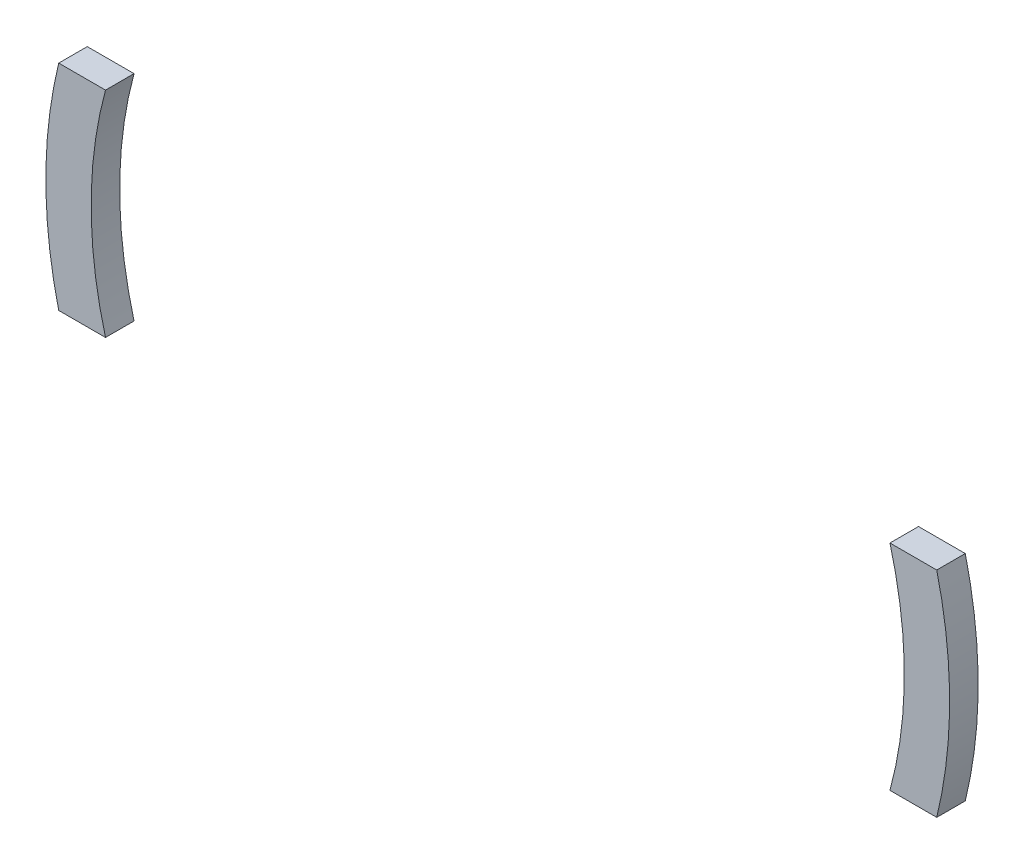
ISO-10303-21;
HEADER;
FILE_DESCRIPTION(('STEP AP214'),'2;1');
FILE_NAME('part.step','',(''),(''),'','','');
FILE_SCHEMA(('AUTOMOTIVE_DESIGN { 1 0 10303 214 1 1 1 1 }'));
ENDSEC;
DATA;
#1=APPLICATION_CONTEXT('core data for automotive mechanical design processes');
#2=APPLICATION_PROTOCOL_DEFINITION('international standard','automotive_design',2000,#1);
#3=PRODUCT_CONTEXT('',#1,'mechanical');
#4=PRODUCT('Part','Part','',(#3));
#5=PRODUCT_RELATED_PRODUCT_CATEGORY('part','',(#4));
#6=PRODUCT_DEFINITION_FORMATION('','',#4);
#7=PRODUCT_DEFINITION_CONTEXT('part definition',#1,'design');
#8=PRODUCT_DEFINITION('design','',#6,#7);
#9=PRODUCT_DEFINITION_SHAPE('','',#8);
#10=(LENGTH_UNIT() NAMED_UNIT(*) SI_UNIT(.MILLI.,.METRE.));
#11=(NAMED_UNIT(*) PLANE_ANGLE_UNIT() SI_UNIT($,.RADIAN.));
#12=(NAMED_UNIT(*) SI_UNIT($,.STERADIAN.) SOLID_ANGLE_UNIT());
#13=UNCERTAINTY_MEASURE_WITH_UNIT(LENGTH_MEASURE(1.E-05),#10,'distance_accuracy_value','');
#14=(GEOMETRIC_REPRESENTATION_CONTEXT(3) GLOBAL_UNCERTAINTY_ASSIGNED_CONTEXT((#13)) GLOBAL_UNIT_ASSIGNED_CONTEXT((#10,
#11,#12)) REPRESENTATION_CONTEXT('',''));
#15=CARTESIAN_POINT('',(0.,0.,0.));
#16=DIRECTION('',(0.,0.,1.));
#17=DIRECTION('',(1.,0.,0.));
#18=AXIS2_PLACEMENT_3D('',#15,#16,#17);
#19=CARTESIAN_POINT('',(0.,0.,2.54));
#20=DIRECTION('',(0.,0.,-1.));
#21=DIRECTION('',(-1.,0.,0.));
#22=AXIS2_PLACEMENT_3D('',#19,#20,#21);
#23=CYLINDRICAL_SURFACE('',#22,36.19);
#24=CARTESIAN_POINT('',(0.,0.,0.));
#25=DIRECTION('',(0.,0.,-1.));
#26=DIRECTION('',(1.,0.,0.));
#27=AXIS2_PLACEMENT_3D('',#24,#25,#26);
#28=CIRCLE('',#27,36.19);
#29=CARTESIAN_POINT('',(34.9112707270073,9.53515999999999,0.));
#30=VERTEX_POINT('',#29);
#31=CARTESIAN_POINT('',(34.9112707270073,-9.53515999999999,0.));
#32=VERTEX_POINT('',#31);
#33=EDGE_CURVE('E110',#30,#32,#28,.T.);
#34=ORIENTED_EDGE('',*,*,#33,.T.);
#35=DIRECTION('',(0.,0.,-1.));
#36=VECTOR('',#35,1.);
#37=CARTESIAN_POINT('',(34.9112707270073,-9.53515999999999,2.54));
#38=LINE('',#37,#36);
#39=CARTESIAN_POINT('',(34.9112707270073,-9.53515999999999,2.54));
#40=VERTEX_POINT('',#39);
#41=EDGE_CURVE('E12',#40,#32,#38,.T.);
#42=ORIENTED_EDGE('',*,*,#41,.F.);
#43=CARTESIAN_POINT('',(0.,0.,2.54));
#44=DIRECTION('',(0.,0.,-1.));
#45=DIRECTION('',(1.,0.,0.));
#46=AXIS2_PLACEMENT_3D('',#43,#44,#45);
#47=CIRCLE('',#46,36.19);
#48=CARTESIAN_POINT('',(34.9112707270073,9.53515999999999,2.54));
#49=VERTEX_POINT('',#48);
#50=EDGE_CURVE('E98',#49,#40,#47,.T.);
#51=ORIENTED_EDGE('',*,*,#50,.F.);
#52=DIRECTION('',(0.,0.,-1.));
#53=VECTOR('',#52,1.);
#54=CARTESIAN_POINT('',(34.9112707270073,9.53515999999999,2.54));
#55=LINE('',#54,#53);
#56=EDGE_CURVE('E106',#49,#30,#55,.T.);
#57=ORIENTED_EDGE('',*,*,#56,.T.);
#58=EDGE_LOOP('',(#34,#42,#51,#57));
#59=FACE_BOUND('',#58,.T.);
#60=ADVANCED_FACE('F47',(#59),#23,.F.);
#61=CARTESIAN_POINT('',(34.9112707270073,-9.53515999999999,2.54));
#62=DIRECTION('',(0.,1.,0.));
#63=DIRECTION('',(-1.,0.,0.));
#64=AXIS2_PLACEMENT_3D('',#61,#62,#63);
#65=PLANE('',#64);
#66=DIRECTION('',(1.,0.,0.));
#67=VECTOR('',#66,1.);
#68=CARTESIAN_POINT('',(34.9112707270073,-9.53515999999999,0.));
#69=LINE('',#68,#67);
#70=CARTESIAN_POINT('',(39.0757008737451,-9.53515999999999,0.));
#71=VERTEX_POINT('',#70);
#72=EDGE_CURVE('E102',#32,#71,#69,.T.);
#73=ORIENTED_EDGE('',*,*,#72,.T.);
#74=DIRECTION('',(0.,0.,-1.));
#75=VECTOR('',#74,1.);
#76=CARTESIAN_POINT('',(39.0757008737451,-9.53515999999999,2.54));
#77=LINE('',#76,#75);
#78=CARTESIAN_POINT('',(39.0757008737451,-9.53515999999999,2.54));
#79=VERTEX_POINT('',#78);
#80=EDGE_CURVE('E55',#79,#71,#77,.T.);
#81=ORIENTED_EDGE('',*,*,#80,.F.);
#82=DIRECTION('',(1.,0.,0.));
#83=VECTOR('',#82,1.);
#84=CARTESIAN_POINT('',(34.9112707270073,-9.53515999999999,2.54));
#85=LINE('',#84,#83);
#86=EDGE_CURVE('E93',#40,#79,#85,.T.);
#87=ORIENTED_EDGE('',*,*,#86,.F.);
#88=ORIENTED_EDGE('',*,*,#41,.T.);
#89=EDGE_LOOP('',(#73,#81,#87,#88));
#90=FACE_BOUND('',#89,.T.);
#91=ADVANCED_FACE('F101',(#90),#65,.F.);
#92=CARTESIAN_POINT('',(0.,0.,2.54));
#93=DIRECTION('',(0.,0.,-1.));
#94=DIRECTION('',(-1.,0.,0.));
#95=AXIS2_PLACEMENT_3D('',#92,#93,#94);
#96=CYLINDRICAL_SURFACE('',#95,40.2222534798835);
#97=CARTESIAN_POINT('',(0.,0.,0.));
#98=DIRECTION('',(0.,0.,1.));
#99=DIRECTION('',(1.,0.,0.));
#100=AXIS2_PLACEMENT_3D('',#97,#98,#99);
#101=CIRCLE('',#100,40.2222534798835);
#102=CARTESIAN_POINT('',(39.0757008737451,9.53516,0.));
#103=VERTEX_POINT('',#102);
#104=EDGE_CURVE('E80',#71,#103,#101,.T.);
#105=ORIENTED_EDGE('',*,*,#104,.T.);
#106=DIRECTION('',(0.,0.,-1.));
#107=VECTOR('',#106,1.);
#108=CARTESIAN_POINT('',(39.0757008737451,9.53516,2.54));
#109=LINE('',#108,#107);
#110=CARTESIAN_POINT('',(39.0757008737451,9.53516,2.54));
#111=VERTEX_POINT('',#110);
#112=EDGE_CURVE('E103',#111,#103,#109,.T.);
#113=ORIENTED_EDGE('',*,*,#112,.F.);
#114=CARTESIAN_POINT('',(0.,0.,2.54));
#115=DIRECTION('',(0.,0.,1.));
#116=DIRECTION('',(1.,0.,0.));
#117=AXIS2_PLACEMENT_3D('',#114,#115,#116);
#118=CIRCLE('',#117,40.2222534798835);
#119=EDGE_CURVE('E96',#79,#111,#118,.T.);
#120=ORIENTED_EDGE('',*,*,#119,.F.);
#121=ORIENTED_EDGE('',*,*,#80,.T.);
#122=EDGE_LOOP('',(#105,#113,#120,#121));
#123=FACE_BOUND('',#122,.T.);
#124=ADVANCED_FACE('F104',(#123),#96,.T.);
#125=CARTESIAN_POINT('',(34.9112707270073,9.53515999999999,2.54));
#126=DIRECTION('',(0.,-1.,0.));
#127=DIRECTION('',(0.,0.,-1.));
#128=AXIS2_PLACEMENT_3D('',#125,#126,#127);
#129=PLANE('',#128);
#130=DIRECTION('',(-1.,0.,0.));
#131=VECTOR('',#130,1.);
#132=CARTESIAN_POINT('',(34.9112707270073,9.53515999999999,0.));
#133=LINE('',#132,#131);
#134=EDGE_CURVE('E86',#103,#30,#133,.T.);
#135=ORIENTED_EDGE('',*,*,#134,.T.);
#136=ORIENTED_EDGE('',*,*,#56,.F.);
#137=DIRECTION('',(-1.,0.,0.));
#138=VECTOR('',#137,1.);
#139=CARTESIAN_POINT('',(34.9112707270073,9.53515999999999,2.54));
#140=LINE('',#139,#138);
#141=EDGE_CURVE('E63',#111,#49,#140,.T.);
#142=ORIENTED_EDGE('',*,*,#141,.F.);
#143=ORIENTED_EDGE('',*,*,#112,.T.);
#144=EDGE_LOOP('',(#135,#136,#142,#143));
#145=FACE_BOUND('',#144,.T.);
#146=ADVANCED_FACE('F117',(#145),#129,.F.);
#147=CARTESIAN_POINT('',(0.,0.,2.54));
#148=DIRECTION('',(0.,0.,1.));
#149=DIRECTION('',(1.,0.,0.));
#150=AXIS2_PLACEMENT_3D('',#147,#148,#149);
#151=PLANE('',#150);
#152=ORIENTED_EDGE('',*,*,#50,.T.);
#153=ORIENTED_EDGE('',*,*,#86,.T.);
#154=ORIENTED_EDGE('',*,*,#119,.T.);
#155=ORIENTED_EDGE('',*,*,#141,.T.);
#156=EDGE_LOOP('',(#152,#153,#154,#155));
#157=FACE_BOUND('',#156,.T.);
#158=ADVANCED_FACE('F94',(#157),#151,.T.);
#159=CARTESIAN_POINT('',(0.,0.,0.));
#160=DIRECTION('',(0.,0.,1.));
#161=DIRECTION('',(1.,0.,0.));
#162=AXIS2_PLACEMENT_3D('',#159,#160,#161);
#163=PLANE('',#162);
#164=ORIENTED_EDGE('',*,*,#33,.F.);
#165=ORIENTED_EDGE('',*,*,#134,.F.);
#166=ORIENTED_EDGE('',*,*,#104,.F.);
#167=ORIENTED_EDGE('',*,*,#72,.F.);
#168=EDGE_LOOP('',(#164,#165,#166,#167));
#169=FACE_BOUND('',#168,.T.);
#170=ADVANCED_FACE('F120',(#169),#163,.F.);
#171=CLOSED_SHELL('',(#60,#91,#124,#146,#158,#170));
#172=MANIFOLD_SOLID_BREP('B2',#171);
#173=CARTESIAN_POINT('',(0.,0.,2.54));
#174=DIRECTION('',(0.,0.,-1.));
#175=DIRECTION('',(-1.,0.,0.));
#176=AXIS2_PLACEMENT_3D('',#173,#174,#175);
#177=CYLINDRICAL_SURFACE('',#176,36.19);
#178=CARTESIAN_POINT('',(0.,0.,0.));
#179=DIRECTION('',(0.,0.,-1.));
#180=DIRECTION('',(1.,0.,0.));
#181=AXIS2_PLACEMENT_3D('',#178,#179,#180);
#182=CIRCLE('',#181,36.19);
#183=CARTESIAN_POINT('',(-34.9112707270073,-9.53516000000002,0.));
#184=VERTEX_POINT('',#183);
#185=CARTESIAN_POINT('',(-34.9112707270073,9.53516,0.));
#186=VERTEX_POINT('',#185);
#187=EDGE_CURVE('E234',#184,#186,#182,.T.);
#188=ORIENTED_EDGE('',*,*,#187,.T.);
#189=DIRECTION('',(0.,0.,-1.));
#190=VECTOR('',#189,1.);
#191=CARTESIAN_POINT('',(-34.9112707270073,9.53516,2.54));
#192=LINE('',#191,#190);
#193=CARTESIAN_POINT('',(-34.9112707270073,9.53516,2.54));
#194=VERTEX_POINT('',#193);
#195=EDGE_CURVE('E45',#194,#186,#192,.T.);
#196=ORIENTED_EDGE('',*,*,#195,.F.);
#197=CARTESIAN_POINT('',(0.,0.,2.54));
#198=DIRECTION('',(0.,0.,-1.));
#199=DIRECTION('',(1.,0.,0.));
#200=AXIS2_PLACEMENT_3D('',#197,#198,#199);
#201=CIRCLE('',#200,36.19);
#202=CARTESIAN_POINT('',(-34.9112707270073,-9.53516000000002,2.54));
#203=VERTEX_POINT('',#202);
#204=EDGE_CURVE('E222',#203,#194,#201,.T.);
#205=ORIENTED_EDGE('',*,*,#204,.F.);
#206=DIRECTION('',(0.,0.,-1.));
#207=VECTOR('',#206,1.);
#208=CARTESIAN_POINT('',(-34.9112707270073,-9.53516000000002,2.54));
#209=LINE('',#208,#207);
#210=EDGE_CURVE('E230',#203,#184,#209,.T.);
#211=ORIENTED_EDGE('',*,*,#210,.T.);
#212=EDGE_LOOP('',(#188,#196,#205,#211));
#213=FACE_BOUND('',#212,.T.);
#214=ADVANCED_FACE('F171',(#213),#177,.F.);
#215=CARTESIAN_POINT('',(-39.0757008737451,9.53516,2.54));
#216=DIRECTION('',(0.,-1.,0.));
#217=DIRECTION('',(0.,0.,-1.));
#218=AXIS2_PLACEMENT_3D('',#215,#216,#217);
#219=PLANE('',#218);
#220=DIRECTION('',(-1.,0.,0.));
#221=VECTOR('',#220,1.);
#222=CARTESIAN_POINT('',(-39.0757008737451,9.53516,0.));
#223=LINE('',#222,#221);
#224=CARTESIAN_POINT('',(-39.0757008737451,9.53516000000001,0.));
#225=VERTEX_POINT('',#224);
#226=EDGE_CURVE('E226',#186,#225,#223,.T.);
#227=ORIENTED_EDGE('',*,*,#226,.T.);
#228=DIRECTION('',(0.,0.,-1.));
#229=VECTOR('',#228,1.);
#230=CARTESIAN_POINT('',(-39.0757008737451,9.53516000000001,2.54));
#231=LINE('',#230,#229);
#232=CARTESIAN_POINT('',(-39.0757008737451,9.53516000000001,2.54));
#233=VERTEX_POINT('',#232);
#234=EDGE_CURVE('E179',#233,#225,#231,.T.);
#235=ORIENTED_EDGE('',*,*,#234,.F.);
#236=DIRECTION('',(-1.,0.,0.));
#237=VECTOR('',#236,1.);
#238=CARTESIAN_POINT('',(-39.0757008737451,9.53516,2.54));
#239=LINE('',#238,#237);
#240=EDGE_CURVE('E217',#194,#233,#239,.T.);
#241=ORIENTED_EDGE('',*,*,#240,.F.);
#242=ORIENTED_EDGE('',*,*,#195,.T.);
#243=EDGE_LOOP('',(#227,#235,#241,#242));
#244=FACE_BOUND('',#243,.T.);
#245=ADVANCED_FACE('F225',(#244),#219,.F.);
#246=CARTESIAN_POINT('',(0.,0.,2.54));
#247=DIRECTION('',(0.,0.,-1.));
#248=DIRECTION('',(-1.,0.,0.));
#249=AXIS2_PLACEMENT_3D('',#246,#247,#248);
#250=CYLINDRICAL_SURFACE('',#249,40.2222534798835);
#251=CARTESIAN_POINT('',(0.,0.,0.));
#252=DIRECTION('',(0.,0.,1.));
#253=DIRECTION('',(1.,0.,0.));
#254=AXIS2_PLACEMENT_3D('',#251,#252,#253);
#255=CIRCLE('',#254,40.2222534798835);
#256=CARTESIAN_POINT('',(-39.0757008737451,-9.53516000000002,0.));
#257=VERTEX_POINT('',#256);
#258=EDGE_CURVE('E204',#225,#257,#255,.T.);
#259=ORIENTED_EDGE('',*,*,#258,.T.);
#260=DIRECTION('',(0.,0.,-1.));
#261=VECTOR('',#260,1.);
#262=CARTESIAN_POINT('',(-39.0757008737451,-9.53516000000002,2.54));
#263=LINE('',#262,#261);
#264=CARTESIAN_POINT('',(-39.0757008737451,-9.53516000000002,2.54));
#265=VERTEX_POINT('',#264);
#266=EDGE_CURVE('E227',#265,#257,#263,.T.);
#267=ORIENTED_EDGE('',*,*,#266,.F.);
#268=CARTESIAN_POINT('',(0.,0.,2.54));
#269=DIRECTION('',(0.,0.,1.));
#270=DIRECTION('',(1.,0.,0.));
#271=AXIS2_PLACEMENT_3D('',#268,#269,#270);
#272=CIRCLE('',#271,40.2222534798835);
#273=EDGE_CURVE('E220',#233,#265,#272,.T.);
#274=ORIENTED_EDGE('',*,*,#273,.F.);
#275=ORIENTED_EDGE('',*,*,#234,.T.);
#276=EDGE_LOOP('',(#259,#267,#274,#275));
#277=FACE_BOUND('',#276,.T.);
#278=ADVANCED_FACE('F228',(#277),#250,.T.);
#279=CARTESIAN_POINT('',(-39.0757008737451,-9.53516000000002,2.54));
#280=DIRECTION('',(0.,1.,0.));
#281=DIRECTION('',(-1.,0.,0.));
#282=AXIS2_PLACEMENT_3D('',#279,#280,#281);
#283=PLANE('',#282);
#284=DIRECTION('',(1.,0.,0.));
#285=VECTOR('',#284,1.);
#286=CARTESIAN_POINT('',(-39.0757008737451,-9.53516000000002,0.));
#287=LINE('',#286,#285);
#288=EDGE_CURVE('E210',#257,#184,#287,.T.);
#289=ORIENTED_EDGE('',*,*,#288,.T.);
#290=ORIENTED_EDGE('',*,*,#210,.F.);
#291=DIRECTION('',(1.,0.,0.));
#292=VECTOR('',#291,1.);
#293=CARTESIAN_POINT('',(-39.0757008737451,-9.53516000000002,2.54));
#294=LINE('',#293,#292);
#295=EDGE_CURVE('E187',#265,#203,#294,.T.);
#296=ORIENTED_EDGE('',*,*,#295,.F.);
#297=ORIENTED_EDGE('',*,*,#266,.T.);
#298=EDGE_LOOP('',(#289,#290,#296,#297));
#299=FACE_BOUND('',#298,.T.);
#300=ADVANCED_FACE('F241',(#299),#283,.F.);
#301=CARTESIAN_POINT('',(0.,0.,2.54));
#302=DIRECTION('',(0.,0.,1.));
#303=DIRECTION('',(1.,0.,0.));
#304=AXIS2_PLACEMENT_3D('',#301,#302,#303);
#305=PLANE('',#304);
#306=ORIENTED_EDGE('',*,*,#204,.T.);
#307=ORIENTED_EDGE('',*,*,#240,.T.);
#308=ORIENTED_EDGE('',*,*,#273,.T.);
#309=ORIENTED_EDGE('',*,*,#295,.T.);
#310=EDGE_LOOP('',(#306,#307,#308,#309));
#311=FACE_BOUND('',#310,.T.);
#312=ADVANCED_FACE('F218',(#311),#305,.T.);
#313=CARTESIAN_POINT('',(0.,0.,0.));
#314=DIRECTION('',(0.,0.,1.));
#315=DIRECTION('',(1.,0.,0.));
#316=AXIS2_PLACEMENT_3D('',#313,#314,#315);
#317=PLANE('',#316);
#318=ORIENTED_EDGE('',*,*,#187,.F.);
#319=ORIENTED_EDGE('',*,*,#288,.F.);
#320=ORIENTED_EDGE('',*,*,#258,.F.);
#321=ORIENTED_EDGE('',*,*,#226,.F.);
#322=EDGE_LOOP('',(#318,#319,#320,#321));
#323=FACE_BOUND('',#322,.T.);
#324=ADVANCED_FACE('F244',(#323),#317,.F.);
#325=CLOSED_SHELL('',(#214,#245,#278,#300,#312,#324));
#326=MANIFOLD_SOLID_BREP('B6',#325);
#327=ADVANCED_BREP_SHAPE_REPRESENTATION('',(#18,#172,#326),#14);
#328=SHAPE_DEFINITION_REPRESENTATION(#9,#327);
ENDSEC;
END-ISO-10303-21;
